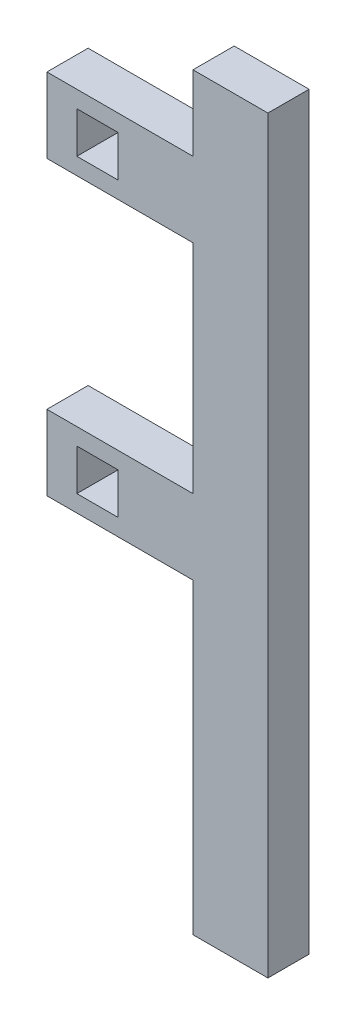
ISO-10303-21;
HEADER;
FILE_DESCRIPTION(('STEP AP214'),'2;1');
FILE_NAME('part.step','',(''),(''),'','','');
FILE_SCHEMA(('AUTOMOTIVE_DESIGN { 1 0 10303 214 1 1 1 1 }'));
ENDSEC;
DATA;
#1=APPLICATION_CONTEXT('core data for automotive mechanical design processes');
#2=APPLICATION_PROTOCOL_DEFINITION('international standard','automotive_design',2000,#1);
#3=PRODUCT_CONTEXT('',#1,'mechanical');
#4=PRODUCT('Part','Part','',(#3));
#5=PRODUCT_RELATED_PRODUCT_CATEGORY('part','',(#4));
#6=PRODUCT_DEFINITION_FORMATION('','',#4);
#7=PRODUCT_DEFINITION_CONTEXT('part definition',#1,'design');
#8=PRODUCT_DEFINITION('design','',#6,#7);
#9=PRODUCT_DEFINITION_SHAPE('','',#8);
#10=(LENGTH_UNIT() NAMED_UNIT(*) SI_UNIT(.MILLI.,.METRE.));
#11=(NAMED_UNIT(*) PLANE_ANGLE_UNIT() SI_UNIT($,.RADIAN.));
#12=(NAMED_UNIT(*) SI_UNIT($,.STERADIAN.) SOLID_ANGLE_UNIT());
#13=UNCERTAINTY_MEASURE_WITH_UNIT(LENGTH_MEASURE(1.E-05),#10,'distance_accuracy_value','');
#14=(GEOMETRIC_REPRESENTATION_CONTEXT(3) GLOBAL_UNCERTAINTY_ASSIGNED_CONTEXT((#13)) GLOBAL_UNIT_ASSIGNED_CONTEXT((#10,
#11,#12)) REPRESENTATION_CONTEXT('',''));
#15=CARTESIAN_POINT('',(0.,0.,0.));
#16=DIRECTION('',(0.,0.,1.));
#17=DIRECTION('',(1.,0.,0.));
#18=AXIS2_PLACEMENT_3D('',#15,#16,#17);
#19=CARTESIAN_POINT('',(0.,0.,5.5));
#20=DIRECTION('',(0.,0.,1.));
#21=DIRECTION('',(1.,0.,0.));
#22=AXIS2_PLACEMENT_3D('',#19,#20,#21);
#23=PLANE('',#22);
#24=DIRECTION('',(-1.,0.,0.));
#25=VECTOR('',#24,1.);
#26=CARTESIAN_POINT('',(12.75,5.,5.5));
#27=LINE('',#26,#25);
#28=CARTESIAN_POINT('',(12.75,5.,5.5));
#29=VERTEX_POINT('',#28);
#30=CARTESIAN_POINT('',(-6.75,5.,5.5));
#31=VERTEX_POINT('',#30);
#32=EDGE_CURVE('E236',#29,#31,#27,.T.);
#33=ORIENTED_EDGE('',*,*,#32,.T.);
#34=DIRECTION('',(0.,-1.,0.));
#35=VECTOR('',#34,1.);
#36=CARTESIAN_POINT('',(-6.75,5.,5.5));
#37=LINE('',#36,#35);
#38=CARTESIAN_POINT('',(-6.75,-5.,5.5));
#39=VERTEX_POINT('',#38);
#40=EDGE_CURVE('E239',#31,#39,#37,.T.);
#41=ORIENTED_EDGE('',*,*,#40,.T.);
#42=DIRECTION('',(1.,0.,0.));
#43=VECTOR('',#42,1.);
#44=CARTESIAN_POINT('',(-6.75,-5.,5.5));
#45=LINE('',#44,#43);
#46=CARTESIAN_POINT('',(12.75,-5.,5.5));
#47=VERTEX_POINT('',#46);
#48=EDGE_CURVE('E242',#39,#47,#45,.T.);
#49=ORIENTED_EDGE('',*,*,#48,.T.);
#50=DIRECTION('',(0.,-1.,0.));
#51=VECTOR('',#50,1.);
#52=CARTESIAN_POINT('',(12.75,-5.,5.5));
#53=LINE('',#52,#51);
#54=CARTESIAN_POINT('',(12.75,-46.,5.5));
#55=VERTEX_POINT('',#54);
#56=EDGE_CURVE('E244',#47,#55,#53,.T.);
#57=ORIENTED_EDGE('',*,*,#56,.T.);
#58=DIRECTION('',(1.,0.,0.));
#59=VECTOR('',#58,1.);
#60=CARTESIAN_POINT('',(12.75,-46.,5.5));
#61=LINE('',#60,#59);
#62=CARTESIAN_POINT('',(22.75,-46.,5.5));
#63=VERTEX_POINT('',#62);
#64=EDGE_CURVE('E246',#55,#63,#61,.T.);
#65=ORIENTED_EDGE('',*,*,#64,.T.);
#66=DIRECTION('',(0.,1.,0.));
#67=VECTOR('',#66,1.);
#68=CARTESIAN_POINT('',(22.75,-46.,5.5));
#69=LINE('',#68,#67);
#70=CARTESIAN_POINT('',(22.75,54.,5.5));
#71=VERTEX_POINT('',#70);
#72=EDGE_CURVE('E248',#63,#71,#69,.T.);
#73=ORIENTED_EDGE('',*,*,#72,.T.);
#74=DIRECTION('',(-1.,0.,0.));
#75=VECTOR('',#74,1.);
#76=CARTESIAN_POINT('',(22.75,54.,5.5));
#77=LINE('',#76,#75);
#78=CARTESIAN_POINT('',(12.75,54.,5.5));
#79=VERTEX_POINT('',#78);
#80=EDGE_CURVE('E250',#71,#79,#77,.T.);
#81=ORIENTED_EDGE('',*,*,#80,.T.);
#82=DIRECTION('',(0.,-1.,0.));
#83=VECTOR('',#82,1.);
#84=CARTESIAN_POINT('',(12.75,54.,5.5));
#85=LINE('',#84,#83);
#86=CARTESIAN_POINT('',(12.75,44.,5.5));
#87=VERTEX_POINT('',#86);
#88=EDGE_CURVE('E252',#79,#87,#85,.T.);
#89=ORIENTED_EDGE('',*,*,#88,.T.);
#90=DIRECTION('',(-1.,0.,0.));
#91=VECTOR('',#90,1.);
#92=CARTESIAN_POINT('',(12.75,44.,5.5));
#93=LINE('',#92,#91);
#94=CARTESIAN_POINT('',(-6.75000000000001,44.,5.5));
#95=VERTEX_POINT('',#94);
#96=EDGE_CURVE('E254',#87,#95,#93,.T.);
#97=ORIENTED_EDGE('',*,*,#96,.T.);
#98=DIRECTION('',(0.,-1.,0.));
#99=VECTOR('',#98,1.);
#100=CARTESIAN_POINT('',(-6.75000000000001,44.,5.5));
#101=LINE('',#100,#99);
#102=CARTESIAN_POINT('',(-6.75000000000001,34.,5.5));
#103=VERTEX_POINT('',#102);
#104=EDGE_CURVE('E256',#95,#103,#101,.T.);
#105=ORIENTED_EDGE('',*,*,#104,.T.);
#106=DIRECTION('',(1.,0.,0.));
#107=VECTOR('',#106,1.);
#108=CARTESIAN_POINT('',(-6.75000000000001,34.,5.5));
#109=LINE('',#108,#107);
#110=CARTESIAN_POINT('',(12.75,34.,5.5));
#111=VERTEX_POINT('',#110);
#112=EDGE_CURVE('E258',#103,#111,#109,.T.);
#113=ORIENTED_EDGE('',*,*,#112,.T.);
#114=DIRECTION('',(0.,-1.,0.));
#115=VECTOR('',#114,1.);
#116=CARTESIAN_POINT('',(12.75,34.,5.5));
#117=LINE('',#116,#115);
#118=EDGE_CURVE('E260',#111,#29,#117,.T.);
#119=ORIENTED_EDGE('',*,*,#118,.T.);
#120=EDGE_LOOP('',(#33,#41,#49,#57,#65,#73,#81,#89,#97,#105,#113,#119));
#121=FACE_BOUND('',#120,.T.);
#122=DIRECTION('',(-1.,0.,0.));
#123=VECTOR('',#122,1.);
#124=CARTESIAN_POINT('',(-2.75,2.75,5.5));
#125=LINE('',#124,#123);
#126=CARTESIAN_POINT('',(2.75,2.75,5.5));
#127=VERTEX_POINT('',#126);
#128=CARTESIAN_POINT('',(-2.75,2.75,5.5));
#129=VERTEX_POINT('',#128);
#130=EDGE_CURVE('E207',#127,#129,#125,.T.);
#131=ORIENTED_EDGE('',*,*,#130,.F.);
#132=DIRECTION('',(0.,1.,0.));
#133=VECTOR('',#132,1.);
#134=CARTESIAN_POINT('',(2.75,2.75,5.5));
#135=LINE('',#134,#133);
#136=CARTESIAN_POINT('',(2.75,-2.75,5.5));
#137=VERTEX_POINT('',#136);
#138=EDGE_CURVE('E205',#137,#127,#135,.T.);
#139=ORIENTED_EDGE('',*,*,#138,.F.);
#140=DIRECTION('',(1.,0.,0.));
#141=VECTOR('',#140,1.);
#142=CARTESIAN_POINT('',(-2.75,-2.75,5.5));
#143=LINE('',#142,#141);
#144=CARTESIAN_POINT('',(-2.75,-2.75,5.5));
#145=VERTEX_POINT('',#144);
#146=EDGE_CURVE('E213',#145,#137,#143,.T.);
#147=ORIENTED_EDGE('',*,*,#146,.F.);
#148=DIRECTION('',(0.,-1.,0.));
#149=VECTOR('',#148,1.);
#150=CARTESIAN_POINT('',(-2.75,2.75,5.5));
#151=LINE('',#150,#149);
#152=EDGE_CURVE('E210',#129,#145,#151,.T.);
#153=ORIENTED_EDGE('',*,*,#152,.F.);
#154=EDGE_LOOP('',(#131,#139,#147,#153));
#155=FACE_BOUND('',#154,.T.);
#156=DIRECTION('',(-1.,0.,0.));
#157=VECTOR('',#156,1.);
#158=CARTESIAN_POINT('',(-2.75,41.75,5.5));
#159=LINE('',#158,#157);
#160=CARTESIAN_POINT('',(2.75,41.75,5.5));
#161=VERTEX_POINT('',#160);
#162=CARTESIAN_POINT('',(-2.75,41.75,5.5));
#163=VERTEX_POINT('',#162);
#164=EDGE_CURVE('E177',#161,#163,#159,.T.);
#165=ORIENTED_EDGE('',*,*,#164,.F.);
#166=DIRECTION('',(0.,1.,0.));
#167=VECTOR('',#166,1.);
#168=CARTESIAN_POINT('',(2.75,41.75,5.5));
#169=LINE('',#168,#167);
#170=CARTESIAN_POINT('',(2.75,36.25,5.5));
#171=VERTEX_POINT('',#170);
#172=EDGE_CURVE('E169',#171,#161,#169,.T.);
#173=ORIENTED_EDGE('',*,*,#172,.F.);
#174=DIRECTION('',(1.,0.,0.));
#175=VECTOR('',#174,1.);
#176=CARTESIAN_POINT('',(-2.75,36.25,5.5));
#177=LINE('',#176,#175);
#178=CARTESIAN_POINT('',(-2.75,36.25,5.5));
#179=VERTEX_POINT('',#178);
#180=EDGE_CURVE('E191',#179,#171,#177,.T.);
#181=ORIENTED_EDGE('',*,*,#180,.F.);
#182=DIRECTION('',(0.,-1.,0.));
#183=VECTOR('',#182,1.);
#184=CARTESIAN_POINT('',(-2.75,41.75,5.5));
#185=LINE('',#184,#183);
#186=EDGE_CURVE('E189',#163,#179,#185,.T.);
#187=ORIENTED_EDGE('',*,*,#186,.F.);
#188=EDGE_LOOP('',(#165,#173,#181,#187));
#189=FACE_BOUND('',#188,.T.);
#190=ADVANCED_FACE('F32',(#121,#155,#189),#23,.T.);
#191=CARTESIAN_POINT('',(0.,0.,0.));
#192=DIRECTION('',(0.,0.,1.));
#193=DIRECTION('',(1.,0.,0.));
#194=AXIS2_PLACEMENT_3D('',#191,#192,#193);
#195=PLANE('',#194);
#196=DIRECTION('',(0.,1.,0.));
#197=VECTOR('',#196,1.);
#198=CARTESIAN_POINT('',(2.75,2.75,0.));
#199=LINE('',#198,#197);
#200=CARTESIAN_POINT('',(2.75,-2.75,0.));
#201=VERTEX_POINT('',#200);
#202=CARTESIAN_POINT('',(2.75,2.75,0.));
#203=VERTEX_POINT('',#202);
#204=EDGE_CURVE('E185',#201,#203,#199,.T.);
#205=ORIENTED_EDGE('',*,*,#204,.T.);
#206=DIRECTION('',(-1.,0.,0.));
#207=VECTOR('',#206,1.);
#208=CARTESIAN_POINT('',(-2.75,2.75,0.));
#209=LINE('',#208,#207);
#210=CARTESIAN_POINT('',(-2.75,2.75,0.));
#211=VERTEX_POINT('',#210);
#212=EDGE_CURVE('E218',#203,#211,#209,.T.);
#213=ORIENTED_EDGE('',*,*,#212,.T.);
#214=DIRECTION('',(0.,-1.,0.));
#215=VECTOR('',#214,1.);
#216=CARTESIAN_POINT('',(-2.75,2.75,0.));
#217=LINE('',#216,#215);
#218=CARTESIAN_POINT('',(-2.75,-2.75,0.));
#219=VERTEX_POINT('',#218);
#220=EDGE_CURVE('E221',#211,#219,#217,.T.);
#221=ORIENTED_EDGE('',*,*,#220,.T.);
#222=DIRECTION('',(1.,0.,0.));
#223=VECTOR('',#222,1.);
#224=CARTESIAN_POINT('',(-2.75,-2.75,0.));
#225=LINE('',#224,#223);
#226=EDGE_CURVE('E208',#219,#201,#225,.T.);
#227=ORIENTED_EDGE('',*,*,#226,.T.);
#228=EDGE_LOOP('',(#205,#213,#221,#227));
#229=FACE_BOUND('',#228,.T.);
#230=DIRECTION('',(-1.,0.,0.));
#231=VECTOR('',#230,1.);
#232=CARTESIAN_POINT('',(12.75,5.,0.));
#233=LINE('',#232,#231);
#234=CARTESIAN_POINT('',(12.75,5.,0.));
#235=VERTEX_POINT('',#234);
#236=CARTESIAN_POINT('',(-6.75,5.,0.));
#237=VERTEX_POINT('',#236);
#238=EDGE_CURVE('E235',#235,#237,#233,.T.);
#239=ORIENTED_EDGE('',*,*,#238,.F.);
#240=DIRECTION('',(0.,-1.,0.));
#241=VECTOR('',#240,1.);
#242=CARTESIAN_POINT('',(12.75,34.,0.));
#243=LINE('',#242,#241);
#244=CARTESIAN_POINT('',(12.75,34.,0.));
#245=VERTEX_POINT('',#244);
#246=EDGE_CURVE('E240',#245,#235,#243,.T.);
#247=ORIENTED_EDGE('',*,*,#246,.F.);
#248=DIRECTION('',(1.,0.,0.));
#249=VECTOR('',#248,1.);
#250=CARTESIAN_POINT('',(-6.75000000000001,34.,0.));
#251=LINE('',#250,#249);
#252=CARTESIAN_POINT('',(-6.75000000000001,34.,0.));
#253=VERTEX_POINT('',#252);
#254=EDGE_CURVE('E283',#253,#245,#251,.T.);
#255=ORIENTED_EDGE('',*,*,#254,.F.);
#256=DIRECTION('',(0.,-1.,0.));
#257=VECTOR('',#256,1.);
#258=CARTESIAN_POINT('',(-6.75000000000001,44.,0.));
#259=LINE('',#258,#257);
#260=CARTESIAN_POINT('',(-6.75000000000001,44.,0.));
#261=VERTEX_POINT('',#260);
#262=EDGE_CURVE('E281',#261,#253,#259,.T.);
#263=ORIENTED_EDGE('',*,*,#262,.F.);
#264=DIRECTION('',(-1.,0.,0.));
#265=VECTOR('',#264,1.);
#266=CARTESIAN_POINT('',(12.75,44.,0.));
#267=LINE('',#266,#265);
#268=CARTESIAN_POINT('',(12.75,44.,0.));
#269=VERTEX_POINT('',#268);
#270=EDGE_CURVE('E279',#269,#261,#267,.T.);
#271=ORIENTED_EDGE('',*,*,#270,.F.);
#272=DIRECTION('',(0.,-1.,0.));
#273=VECTOR('',#272,1.);
#274=CARTESIAN_POINT('',(12.75,54.,0.));
#275=LINE('',#274,#273);
#276=CARTESIAN_POINT('',(12.75,54.,0.));
#277=VERTEX_POINT('',#276);
#278=EDGE_CURVE('E277',#277,#269,#275,.T.);
#279=ORIENTED_EDGE('',*,*,#278,.F.);
#280=DIRECTION('',(-1.,0.,0.));
#281=VECTOR('',#280,1.);
#282=CARTESIAN_POINT('',(22.75,54.,0.));
#283=LINE('',#282,#281);
#284=CARTESIAN_POINT('',(22.75,54.,0.));
#285=VERTEX_POINT('',#284);
#286=EDGE_CURVE('E275',#285,#277,#283,.T.);
#287=ORIENTED_EDGE('',*,*,#286,.F.);
#288=DIRECTION('',(0.,1.,0.));
#289=VECTOR('',#288,1.);
#290=CARTESIAN_POINT('',(22.75,-46.,0.));
#291=LINE('',#290,#289);
#292=CARTESIAN_POINT('',(22.75,-46.,0.));
#293=VERTEX_POINT('',#292);
#294=EDGE_CURVE('E273',#293,#285,#291,.T.);
#295=ORIENTED_EDGE('',*,*,#294,.F.);
#296=DIRECTION('',(1.,0.,0.));
#297=VECTOR('',#296,1.);
#298=CARTESIAN_POINT('',(12.75,-46.,0.));
#299=LINE('',#298,#297);
#300=CARTESIAN_POINT('',(12.75,-46.,0.));
#301=VERTEX_POINT('',#300);
#302=EDGE_CURVE('E271',#301,#293,#299,.T.);
#303=ORIENTED_EDGE('',*,*,#302,.F.);
#304=DIRECTION('',(0.,-1.,0.));
#305=VECTOR('',#304,1.);
#306=CARTESIAN_POINT('',(12.75,-5.,0.));
#307=LINE('',#306,#305);
#308=CARTESIAN_POINT('',(12.75,-5.,0.));
#309=VERTEX_POINT('',#308);
#310=EDGE_CURVE('E269',#309,#301,#307,.T.);
#311=ORIENTED_EDGE('',*,*,#310,.F.);
#312=DIRECTION('',(1.,0.,0.));
#313=VECTOR('',#312,1.);
#314=CARTESIAN_POINT('',(-6.75,-5.,0.));
#315=LINE('',#314,#313);
#316=CARTESIAN_POINT('',(-6.75,-5.,0.));
#317=VERTEX_POINT('',#316);
#318=EDGE_CURVE('E267',#317,#309,#315,.T.);
#319=ORIENTED_EDGE('',*,*,#318,.F.);
#320=DIRECTION('',(0.,-1.,0.));
#321=VECTOR('',#320,1.);
#322=CARTESIAN_POINT('',(-6.75,5.,0.));
#323=LINE('',#322,#321);
#324=EDGE_CURVE('E265',#237,#317,#323,.T.);
#325=ORIENTED_EDGE('',*,*,#324,.F.);
#326=EDGE_LOOP('',(#239,#247,#255,#263,#271,#279,#287,#295,#303,#311,#319,#325));
#327=FACE_BOUND('',#326,.T.);
#328=DIRECTION('',(0.,1.,0.));
#329=VECTOR('',#328,1.);
#330=CARTESIAN_POINT('',(2.75,41.75,0.));
#331=LINE('',#330,#329);
#332=CARTESIAN_POINT('',(2.75,36.25,0.));
#333=VERTEX_POINT('',#332);
#334=CARTESIAN_POINT('',(2.75,41.75,0.));
#335=VERTEX_POINT('',#334);
#336=EDGE_CURVE('E55',#333,#335,#331,.T.);
#337=ORIENTED_EDGE('',*,*,#336,.T.);
#338=DIRECTION('',(-1.,0.,0.));
#339=VECTOR('',#338,1.);
#340=CARTESIAN_POINT('',(-2.75,41.75,0.));
#341=LINE('',#340,#339);
#342=CARTESIAN_POINT('',(-2.75,41.75,0.));
#343=VERTEX_POINT('',#342);
#344=EDGE_CURVE('E184',#335,#343,#341,.T.);
#345=ORIENTED_EDGE('',*,*,#344,.T.);
#346=DIRECTION('',(0.,-1.,0.));
#347=VECTOR('',#346,1.);
#348=CARTESIAN_POINT('',(-2.75,41.75,0.));
#349=LINE('',#348,#347);
#350=CARTESIAN_POINT('',(-2.75,36.25,0.));
#351=VERTEX_POINT('',#350);
#352=EDGE_CURVE('E197',#343,#351,#349,.T.);
#353=ORIENTED_EDGE('',*,*,#352,.T.);
#354=DIRECTION('',(1.,0.,0.));
#355=VECTOR('',#354,1.);
#356=CARTESIAN_POINT('',(-2.75,36.25,0.));
#357=LINE('',#356,#355);
#358=EDGE_CURVE('E178',#351,#333,#357,.T.);
#359=ORIENTED_EDGE('',*,*,#358,.T.);
#360=EDGE_LOOP('',(#337,#345,#353,#359));
#361=FACE_BOUND('',#360,.T.);
#362=ADVANCED_FACE('F325',(#229,#327,#361),#195,.F.);
#363=CARTESIAN_POINT('',(12.75,5.,5.5));
#364=DIRECTION('',(0.,-1.,0.));
#365=DIRECTION('',(0.,0.,-1.));
#366=AXIS2_PLACEMENT_3D('',#363,#364,#365);
#367=PLANE('',#366);
#368=ORIENTED_EDGE('',*,*,#238,.T.);
#369=DIRECTION('',(0.,0.,-1.));
#370=VECTOR('',#369,1.);
#371=CARTESIAN_POINT('',(-6.75,5.,5.5));
#372=LINE('',#371,#370);
#373=EDGE_CURVE('E11',#31,#237,#372,.T.);
#374=ORIENTED_EDGE('',*,*,#373,.F.);
#375=ORIENTED_EDGE('',*,*,#32,.F.);
#376=DIRECTION('',(0.,0.,-1.));
#377=VECTOR('',#376,1.);
#378=CARTESIAN_POINT('',(12.75,5.,5.5));
#379=LINE('',#378,#377);
#380=EDGE_CURVE('E262',#29,#235,#379,.T.);
#381=ORIENTED_EDGE('',*,*,#380,.T.);
#382=EDGE_LOOP('',(#368,#374,#375,#381));
#383=FACE_BOUND('',#382,.T.);
#384=ADVANCED_FACE('F34',(#383),#367,.F.);
#385=CARTESIAN_POINT('',(-6.75,5.,5.5));
#386=DIRECTION('',(1.,0.,0.));
#387=DIRECTION('',(0.,0.,-1.));
#388=AXIS2_PLACEMENT_3D('',#385,#386,#387);
#389=PLANE('',#388);
#390=ORIENTED_EDGE('',*,*,#324,.T.);
#391=DIRECTION('',(0.,0.,-1.));
#392=VECTOR('',#391,1.);
#393=CARTESIAN_POINT('',(-6.75,-5.,5.5));
#394=LINE('',#393,#392);
#395=EDGE_CURVE('E40',#39,#317,#394,.T.);
#396=ORIENTED_EDGE('',*,*,#395,.F.);
#397=ORIENTED_EDGE('',*,*,#40,.F.);
#398=ORIENTED_EDGE('',*,*,#373,.T.);
#399=EDGE_LOOP('',(#390,#396,#397,#398));
#400=FACE_BOUND('',#399,.T.);
#401=ADVANCED_FACE('F343',(#400),#389,.F.);
#402=CARTESIAN_POINT('',(-6.75,-5.,5.5));
#403=DIRECTION('',(0.,1.,0.));
#404=DIRECTION('',(0.,0.,1.));
#405=AXIS2_PLACEMENT_3D('',#402,#403,#404);
#406=PLANE('',#405);
#407=ORIENTED_EDGE('',*,*,#318,.T.);
#408=DIRECTION('',(0.,0.,-1.));
#409=VECTOR('',#408,1.);
#410=CARTESIAN_POINT('',(12.75,-5.,5.5));
#411=LINE('',#410,#409);
#412=EDGE_CURVE('E312',#47,#309,#411,.T.);
#413=ORIENTED_EDGE('',*,*,#412,.F.);
#414=ORIENTED_EDGE('',*,*,#48,.F.);
#415=ORIENTED_EDGE('',*,*,#395,.T.);
#416=EDGE_LOOP('',(#407,#413,#414,#415));
#417=FACE_BOUND('',#416,.T.);
#418=ADVANCED_FACE('F319',(#417),#406,.F.);
#419=CARTESIAN_POINT('',(12.75,-5.,5.5));
#420=DIRECTION('',(1.,0.,0.));
#421=DIRECTION('',(0.,1.,0.));
#422=AXIS2_PLACEMENT_3D('',#419,#420,#421);
#423=PLANE('',#422);
#424=ORIENTED_EDGE('',*,*,#310,.T.);
#425=DIRECTION('',(0.,0.,-1.));
#426=VECTOR('',#425,1.);
#427=CARTESIAN_POINT('',(12.75,-46.,5.5));
#428=LINE('',#427,#426);
#429=EDGE_CURVE('E309',#55,#301,#428,.T.);
#430=ORIENTED_EDGE('',*,*,#429,.F.);
#431=ORIENTED_EDGE('',*,*,#56,.F.);
#432=ORIENTED_EDGE('',*,*,#412,.T.);
#433=EDGE_LOOP('',(#424,#430,#431,#432));
#434=FACE_BOUND('',#433,.T.);
#435=ADVANCED_FACE('F331',(#434),#423,.F.);
#436=CARTESIAN_POINT('',(12.75,-46.,5.5));
#437=DIRECTION('',(0.,1.,0.));
#438=DIRECTION('',(0.,0.,1.));
#439=AXIS2_PLACEMENT_3D('',#436,#437,#438);
#440=PLANE('',#439);
#441=ORIENTED_EDGE('',*,*,#302,.T.);
#442=DIRECTION('',(0.,0.,-1.));
#443=VECTOR('',#442,1.);
#444=CARTESIAN_POINT('',(22.75,-46.,5.5));
#445=LINE('',#444,#443);
#446=EDGE_CURVE('E306',#63,#293,#445,.T.);
#447=ORIENTED_EDGE('',*,*,#446,.F.);
#448=ORIENTED_EDGE('',*,*,#64,.F.);
#449=ORIENTED_EDGE('',*,*,#429,.T.);
#450=EDGE_LOOP('',(#441,#447,#448,#449));
#451=FACE_BOUND('',#450,.T.);
#452=ADVANCED_FACE('F335',(#451),#440,.F.);
#453=CARTESIAN_POINT('',(22.75,-46.,5.5));
#454=DIRECTION('',(-1.,0.,0.));
#455=DIRECTION('',(0.,-1.,0.));
#456=AXIS2_PLACEMENT_3D('',#453,#454,#455);
#457=PLANE('',#456);
#458=ORIENTED_EDGE('',*,*,#294,.T.);
#459=DIRECTION('',(0.,0.,-1.));
#460=VECTOR('',#459,1.);
#461=CARTESIAN_POINT('',(22.75,54.,5.5));
#462=LINE('',#461,#460);
#463=EDGE_CURVE('E303',#71,#285,#462,.T.);
#464=ORIENTED_EDGE('',*,*,#463,.F.);
#465=ORIENTED_EDGE('',*,*,#72,.F.);
#466=ORIENTED_EDGE('',*,*,#446,.T.);
#467=EDGE_LOOP('',(#458,#464,#465,#466));
#468=FACE_BOUND('',#467,.T.);
#469=ADVANCED_FACE('F376',(#468),#457,.F.);
#470=CARTESIAN_POINT('',(22.75,54.,5.5));
#471=DIRECTION('',(0.,-1.,0.));
#472=DIRECTION('',(0.,0.,-1.));
#473=AXIS2_PLACEMENT_3D('',#470,#471,#472);
#474=PLANE('',#473);
#475=ORIENTED_EDGE('',*,*,#286,.T.);
#476=DIRECTION('',(0.,0.,-1.));
#477=VECTOR('',#476,1.);
#478=CARTESIAN_POINT('',(12.75,54.,5.5));
#479=LINE('',#478,#477);
#480=EDGE_CURVE('E300',#79,#277,#479,.T.);
#481=ORIENTED_EDGE('',*,*,#480,.F.);
#482=ORIENTED_EDGE('',*,*,#80,.F.);
#483=ORIENTED_EDGE('',*,*,#463,.T.);
#484=EDGE_LOOP('',(#475,#481,#482,#483));
#485=FACE_BOUND('',#484,.T.);
#486=ADVANCED_FACE('F374',(#485),#474,.F.);
#487=CARTESIAN_POINT('',(12.75,54.,5.5));
#488=DIRECTION('',(1.,0.,0.));
#489=DIRECTION('',(0.,1.,0.));
#490=AXIS2_PLACEMENT_3D('',#487,#488,#489);
#491=PLANE('',#490);
#492=ORIENTED_EDGE('',*,*,#278,.T.);
#493=DIRECTION('',(0.,0.,-1.));
#494=VECTOR('',#493,1.);
#495=CARTESIAN_POINT('',(12.75,44.,5.5));
#496=LINE('',#495,#494);
#497=EDGE_CURVE('E297',#87,#269,#496,.T.);
#498=ORIENTED_EDGE('',*,*,#497,.F.);
#499=ORIENTED_EDGE('',*,*,#88,.F.);
#500=ORIENTED_EDGE('',*,*,#480,.T.);
#501=EDGE_LOOP('',(#492,#498,#499,#500));
#502=FACE_BOUND('',#501,.T.);
#503=ADVANCED_FACE('F370',(#502),#491,.F.);
#504=CARTESIAN_POINT('',(12.75,44.,5.5));
#505=DIRECTION('',(0.,-1.,0.));
#506=DIRECTION('',(0.,0.,-1.));
#507=AXIS2_PLACEMENT_3D('',#504,#505,#506);
#508=PLANE('',#507);
#509=ORIENTED_EDGE('',*,*,#270,.T.);
#510=DIRECTION('',(0.,0.,-1.));
#511=VECTOR('',#510,1.);
#512=CARTESIAN_POINT('',(-6.75000000000001,44.,5.5));
#513=LINE('',#512,#511);
#514=EDGE_CURVE('E294',#95,#261,#513,.T.);
#515=ORIENTED_EDGE('',*,*,#514,.F.);
#516=ORIENTED_EDGE('',*,*,#96,.F.);
#517=ORIENTED_EDGE('',*,*,#497,.T.);
#518=EDGE_LOOP('',(#509,#515,#516,#517));
#519=FACE_BOUND('',#518,.T.);
#520=ADVANCED_FACE('F365',(#519),#508,.F.);
#521=CARTESIAN_POINT('',(-6.75000000000001,44.,5.5));
#522=DIRECTION('',(1.,0.,0.));
#523=DIRECTION('',(0.,0.,-1.));
#524=AXIS2_PLACEMENT_3D('',#521,#522,#523);
#525=PLANE('',#524);
#526=ORIENTED_EDGE('',*,*,#262,.T.);
#527=DIRECTION('',(0.,0.,-1.));
#528=VECTOR('',#527,1.);
#529=CARTESIAN_POINT('',(-6.75000000000001,34.,5.5));
#530=LINE('',#529,#528);
#531=EDGE_CURVE('E291',#103,#253,#530,.T.);
#532=ORIENTED_EDGE('',*,*,#531,.F.);
#533=ORIENTED_EDGE('',*,*,#104,.F.);
#534=ORIENTED_EDGE('',*,*,#514,.T.);
#535=EDGE_LOOP('',(#526,#532,#533,#534));
#536=FACE_BOUND('',#535,.T.);
#537=ADVANCED_FACE('F359',(#536),#525,.F.);
#538=CARTESIAN_POINT('',(-6.75000000000001,34.,5.5));
#539=DIRECTION('',(0.,1.,0.));
#540=DIRECTION('',(0.,0.,1.));
#541=AXIS2_PLACEMENT_3D('',#538,#539,#540);
#542=PLANE('',#541);
#543=ORIENTED_EDGE('',*,*,#254,.T.);
#544=DIRECTION('',(0.,0.,-1.));
#545=VECTOR('',#544,1.);
#546=CARTESIAN_POINT('',(12.75,34.,5.5));
#547=LINE('',#546,#545);
#548=EDGE_CURVE('E288',#111,#245,#547,.T.);
#549=ORIENTED_EDGE('',*,*,#548,.F.);
#550=ORIENTED_EDGE('',*,*,#112,.F.);
#551=ORIENTED_EDGE('',*,*,#531,.T.);
#552=EDGE_LOOP('',(#543,#549,#550,#551));
#553=FACE_BOUND('',#552,.T.);
#554=ADVANCED_FACE('F355',(#553),#542,.F.);
#555=CARTESIAN_POINT('',(12.75,34.,5.5));
#556=DIRECTION('',(1.,0.,0.));
#557=DIRECTION('',(0.,1.,0.));
#558=AXIS2_PLACEMENT_3D('',#555,#556,#557);
#559=PLANE('',#558);
#560=ORIENTED_EDGE('',*,*,#246,.T.);
#561=ORIENTED_EDGE('',*,*,#380,.F.);
#562=ORIENTED_EDGE('',*,*,#118,.F.);
#563=ORIENTED_EDGE('',*,*,#548,.T.);
#564=EDGE_LOOP('',(#560,#561,#562,#563));
#565=FACE_BOUND('',#564,.T.);
#566=ADVANCED_FACE('F350',(#565),#559,.F.);
#567=CARTESIAN_POINT('',(2.75,2.75,5.5));
#568=DIRECTION('',(-1.,0.,0.));
#569=DIRECTION('',(0.,-1.,0.));
#570=AXIS2_PLACEMENT_3D('',#567,#568,#569);
#571=PLANE('',#570);
#572=ORIENTED_EDGE('',*,*,#204,.F.);
#573=DIRECTION('',(0.,0.,-1.));
#574=VECTOR('',#573,1.);
#575=CARTESIAN_POINT('',(2.75,-2.75,5.5));
#576=LINE('',#575,#574);
#577=EDGE_CURVE('E215',#137,#201,#576,.T.);
#578=ORIENTED_EDGE('',*,*,#577,.F.);
#579=ORIENTED_EDGE('',*,*,#138,.T.);
#580=DIRECTION('',(0.,0.,-1.));
#581=VECTOR('',#580,1.);
#582=CARTESIAN_POINT('',(2.75,2.75,5.5));
#583=LINE('',#582,#581);
#584=EDGE_CURVE('E232',#127,#203,#583,.T.);
#585=ORIENTED_EDGE('',*,*,#584,.T.);
#586=EDGE_LOOP('',(#572,#578,#579,#585));
#587=FACE_BOUND('',#586,.T.);
#588=ADVANCED_FACE('F393',(#587),#571,.T.);
#589=CARTESIAN_POINT('',(-2.75,2.75,5.5));
#590=DIRECTION('',(0.,-1.,0.));
#591=DIRECTION('',(0.,0.,-1.));
#592=AXIS2_PLACEMENT_3D('',#589,#590,#591);
#593=PLANE('',#592);
#594=ORIENTED_EDGE('',*,*,#212,.F.);
#595=ORIENTED_EDGE('',*,*,#584,.F.);
#596=ORIENTED_EDGE('',*,*,#130,.T.);
#597=DIRECTION('',(0.,0.,-1.));
#598=VECTOR('',#597,1.);
#599=CARTESIAN_POINT('',(-2.75,2.75,5.5));
#600=LINE('',#599,#598);
#601=EDGE_CURVE('E230',#129,#211,#600,.T.);
#602=ORIENTED_EDGE('',*,*,#601,.T.);
#603=EDGE_LOOP('',(#594,#595,#596,#602));
#604=FACE_BOUND('',#603,.T.);
#605=ADVANCED_FACE('F431',(#604),#593,.T.);
#606=CARTESIAN_POINT('',(-2.75,2.75,5.5));
#607=DIRECTION('',(1.,0.,0.));
#608=DIRECTION('',(0.,1.,0.));
#609=AXIS2_PLACEMENT_3D('',#606,#607,#608);
#610=PLANE('',#609);
#611=ORIENTED_EDGE('',*,*,#220,.F.);
#612=ORIENTED_EDGE('',*,*,#601,.F.);
#613=ORIENTED_EDGE('',*,*,#152,.T.);
#614=DIRECTION('',(0.,0.,-1.));
#615=VECTOR('',#614,1.);
#616=CARTESIAN_POINT('',(-2.75,-2.75,5.5));
#617=LINE('',#616,#615);
#618=EDGE_CURVE('E228',#145,#219,#617,.T.);
#619=ORIENTED_EDGE('',*,*,#618,.T.);
#620=EDGE_LOOP('',(#611,#612,#613,#619));
#621=FACE_BOUND('',#620,.T.);
#622=ADVANCED_FACE('F438',(#621),#610,.T.);
#623=CARTESIAN_POINT('',(-2.75,-2.75,5.5));
#624=DIRECTION('',(0.,1.,0.));
#625=DIRECTION('',(0.,0.,1.));
#626=AXIS2_PLACEMENT_3D('',#623,#624,#625);
#627=PLANE('',#626);
#628=ORIENTED_EDGE('',*,*,#226,.F.);
#629=ORIENTED_EDGE('',*,*,#618,.F.);
#630=ORIENTED_EDGE('',*,*,#146,.T.);
#631=ORIENTED_EDGE('',*,*,#577,.T.);
#632=EDGE_LOOP('',(#628,#629,#630,#631));
#633=FACE_BOUND('',#632,.T.);
#634=ADVANCED_FACE('F445',(#633),#627,.T.);
#635=CARTESIAN_POINT('',(2.75,41.75,5.5));
#636=DIRECTION('',(-1.,0.,0.));
#637=DIRECTION('',(0.,0.,1.));
#638=AXIS2_PLACEMENT_3D('',#635,#636,#637);
#639=PLANE('',#638);
#640=ORIENTED_EDGE('',*,*,#336,.F.);
#641=DIRECTION('',(0.,0.,-1.));
#642=VECTOR('',#641,1.);
#643=CARTESIAN_POINT('',(2.75,36.25,5.5));
#644=LINE('',#643,#642);
#645=EDGE_CURVE('E173',#171,#333,#644,.T.);
#646=ORIENTED_EDGE('',*,*,#645,.F.);
#647=ORIENTED_EDGE('',*,*,#172,.T.);
#648=DIRECTION('',(0.,0.,-1.));
#649=VECTOR('',#648,1.);
#650=CARTESIAN_POINT('',(2.75,41.75,5.5));
#651=LINE('',#650,#649);
#652=EDGE_CURVE('E172',#161,#335,#651,.T.);
#653=ORIENTED_EDGE('',*,*,#652,.T.);
#654=EDGE_LOOP('',(#640,#646,#647,#653));
#655=FACE_BOUND('',#654,.T.);
#656=ADVANCED_FACE('F171',(#655),#639,.T.);
#657=CARTESIAN_POINT('',(-2.75,41.75,5.5));
#658=DIRECTION('',(0.,-1.,0.));
#659=DIRECTION('',(0.,0.,-1.));
#660=AXIS2_PLACEMENT_3D('',#657,#658,#659);
#661=PLANE('',#660);
#662=ORIENTED_EDGE('',*,*,#344,.F.);
#663=ORIENTED_EDGE('',*,*,#652,.F.);
#664=ORIENTED_EDGE('',*,*,#164,.T.);
#665=DIRECTION('',(0.,0.,-1.));
#666=VECTOR('',#665,1.);
#667=CARTESIAN_POINT('',(-2.75,41.75,5.5));
#668=LINE('',#667,#666);
#669=EDGE_CURVE('E186',#163,#343,#668,.T.);
#670=ORIENTED_EDGE('',*,*,#669,.T.);
#671=EDGE_LOOP('',(#662,#663,#664,#670));
#672=FACE_BOUND('',#671,.T.);
#673=ADVANCED_FACE('F181',(#672),#661,.T.);
#674=CARTESIAN_POINT('',(-2.75,41.75,5.5));
#675=DIRECTION('',(1.,0.,0.));
#676=DIRECTION('',(0.,1.,0.));
#677=AXIS2_PLACEMENT_3D('',#674,#675,#676);
#678=PLANE('',#677);
#679=ORIENTED_EDGE('',*,*,#352,.F.);
#680=ORIENTED_EDGE('',*,*,#669,.F.);
#681=ORIENTED_EDGE('',*,*,#186,.T.);
#682=DIRECTION('',(0.,0.,-1.));
#683=VECTOR('',#682,1.);
#684=CARTESIAN_POINT('',(-2.75,36.25,5.5));
#685=LINE('',#684,#683);
#686=EDGE_CURVE('E47',#179,#351,#685,.T.);
#687=ORIENTED_EDGE('',*,*,#686,.T.);
#688=EDGE_LOOP('',(#679,#680,#681,#687));
#689=FACE_BOUND('',#688,.T.);
#690=ADVANCED_FACE('F466',(#689),#678,.T.);
#691=CARTESIAN_POINT('',(-2.75,36.25,5.5));
#692=DIRECTION('',(0.,1.,0.));
#693=DIRECTION('',(-1.,0.,0.));
#694=AXIS2_PLACEMENT_3D('',#691,#692,#693);
#695=PLANE('',#694);
#696=ORIENTED_EDGE('',*,*,#358,.F.);
#697=ORIENTED_EDGE('',*,*,#686,.F.);
#698=ORIENTED_EDGE('',*,*,#180,.T.);
#699=ORIENTED_EDGE('',*,*,#645,.T.);
#700=EDGE_LOOP('',(#696,#697,#698,#699));
#701=FACE_BOUND('',#700,.T.);
#702=ADVANCED_FACE('F473',(#701),#695,.T.);
#703=CLOSED_SHELL('',(#190,#362,#384,#401,#418,#435,#452,#469,#486,#503,#520,#537,#554,#566,
#588,#605,#622,#634,#656,#673,#690,#702));
#704=MANIFOLD_SOLID_BREP('B2',#703);
#705=ADVANCED_BREP_SHAPE_REPRESENTATION('',(#18,#704),#14);
#706=SHAPE_DEFINITION_REPRESENTATION(#9,#705);
ENDSEC;
END-ISO-10303-21;
